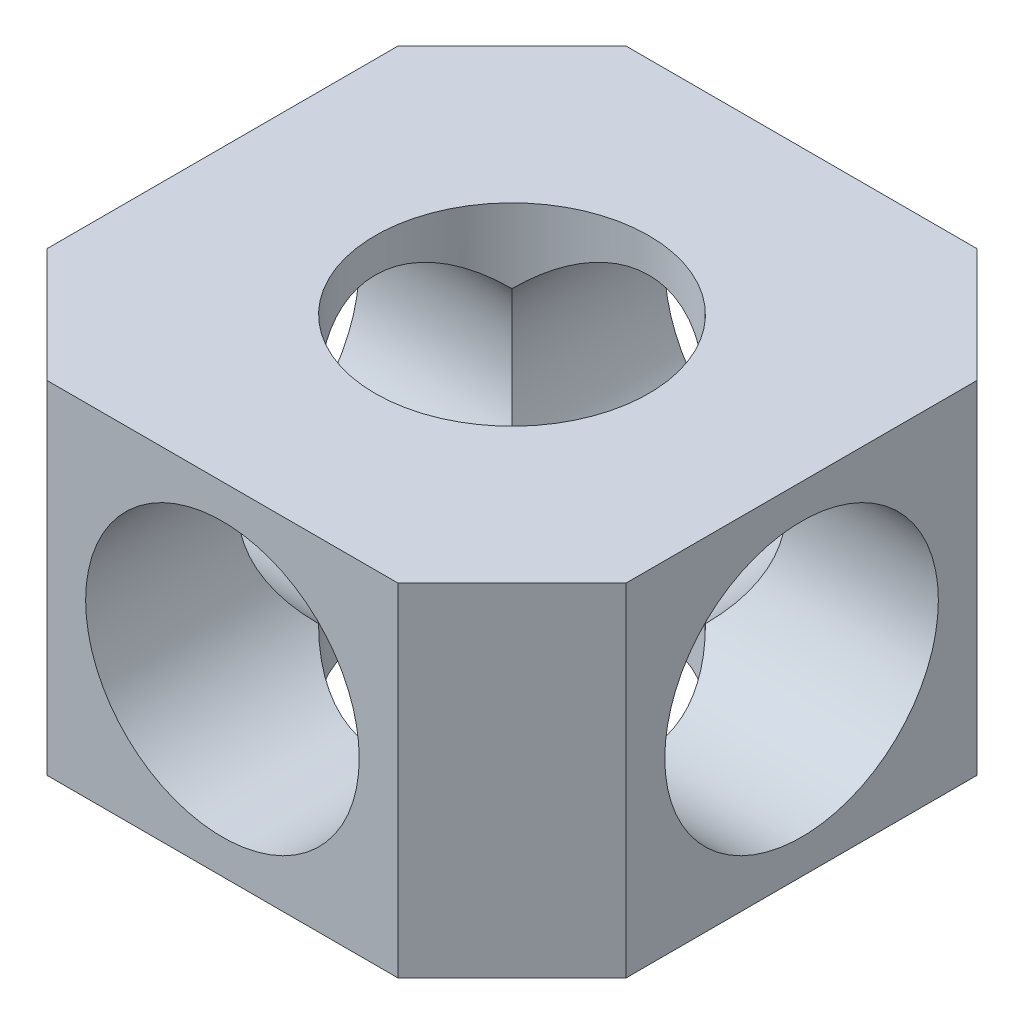
ISO-10303-21;
HEADER;
FILE_DESCRIPTION(('STEP AP214'),'2;1');
FILE_NAME('part.step','',(''),(''),'','','');
FILE_SCHEMA(('AUTOMOTIVE_DESIGN { 1 0 10303 214 1 1 1 1 }'));
ENDSEC;
DATA;
#1=APPLICATION_CONTEXT('core data for automotive mechanical design processes');
#2=APPLICATION_PROTOCOL_DEFINITION('international standard','automotive_design',2000,#1);
#3=PRODUCT_CONTEXT('',#1,'mechanical');
#4=PRODUCT('Part','Part','',(#3));
#5=PRODUCT_RELATED_PRODUCT_CATEGORY('part','',(#4));
#6=PRODUCT_DEFINITION_FORMATION('','',#4);
#7=PRODUCT_DEFINITION_CONTEXT('part definition',#1,'design');
#8=PRODUCT_DEFINITION('design','',#6,#7);
#9=PRODUCT_DEFINITION_SHAPE('','',#8);
#10=(LENGTH_UNIT() NAMED_UNIT(*) SI_UNIT(.MILLI.,.METRE.));
#11=(NAMED_UNIT(*) PLANE_ANGLE_UNIT() SI_UNIT($,.RADIAN.));
#12=(NAMED_UNIT(*) SI_UNIT($,.STERADIAN.) SOLID_ANGLE_UNIT());
#13=UNCERTAINTY_MEASURE_WITH_UNIT(LENGTH_MEASURE(1.E-05),#10,'distance_accuracy_value','');
#14=(GEOMETRIC_REPRESENTATION_CONTEXT(3) GLOBAL_UNCERTAINTY_ASSIGNED_CONTEXT((#13)) GLOBAL_UNIT_ASSIGNED_CONTEXT((#10,
#11,#12)) REPRESENTATION_CONTEXT('',''));
#15=CARTESIAN_POINT('',(0.,0.,0.));
#16=DIRECTION('',(0.,0.,1.));
#17=DIRECTION('',(1.,0.,0.));
#18=AXIS2_PLACEMENT_3D('',#15,#16,#17);
#19=CARTESIAN_POINT('',(0.,-190.5,0.));
#20=DIRECTION('',(0.,1.,0.));
#21=DIRECTION('',(0.,0.,1.));
#22=AXIS2_PLACEMENT_3D('',#19,#20,#21);
#23=CYLINDRICAL_SURFACE('',#22,152.4);
#24=CARTESIAN_POINT('',(0.,190.5,0.));
#25=DIRECTION('',(0.,1.,0.));
#26=DIRECTION('',(0.,0.,1.));
#27=AXIS2_PLACEMENT_3D('',#24,#25,#26);
#28=CIRCLE('',#27,152.4);
#29=CARTESIAN_POINT('',(0.,190.5,152.4));
#30=VERTEX_POINT('',#29);
#31=EDGE_CURVE('E183',#30,#30,#28,.T.);
#32=ORIENTED_EDGE('',*,*,#31,.T.);
#33=EDGE_LOOP('',(#32));
#34=FACE_BOUND('',#33,.T.);
#35=CARTESIAN_POINT('',(0.,0.,0.));
#36=DIRECTION('',(0.,0.707106781186547,0.707106781186547));
#37=DIRECTION('',(0.,0.707106781186547,-0.707106781186547));
#38=AXIS2_PLACEMENT_3D('',#35,#36,#37);
#39=ELLIPSE('',#38,215.52614690566,152.4);
#40=CARTESIAN_POINT('',(-107.763073452829,107.76307345283,-107.763073452831));
#41=VERTEX_POINT('',#40);
#42=CARTESIAN_POINT('',(107.76307345283,107.76307345283,-107.76307345283));
#43=VERTEX_POINT('',#42);
#44=EDGE_CURVE('E155',#41,#43,#39,.F.);
#45=ORIENTED_EDGE('',*,*,#44,.T.);
#46=CARTESIAN_POINT('',(0.,0.,0.));
#47=DIRECTION('',(-0.707106781186547,0.707106781186547,0.));
#48=DIRECTION('',(0.707106781186547,0.707106781186547,0.));
#49=AXIS2_PLACEMENT_3D('',#46,#47,#48);
#50=ELLIPSE('',#49,215.52614690566,152.4);
#51=CARTESIAN_POINT('',(107.763073452829,107.76307345283,107.763073452831));
#52=VERTEX_POINT('',#51);
#53=EDGE_CURVE('E58',#43,#52,#50,.F.);
#54=ORIENTED_EDGE('',*,*,#53,.T.);
#55=CARTESIAN_POINT('',(0.,0.,0.));
#56=DIRECTION('',(0.,0.707106781186547,-0.707106781186547));
#57=DIRECTION('',(0.,0.707106781186547,0.707106781186547));
#58=AXIS2_PLACEMENT_3D('',#55,#56,#57);
#59=ELLIPSE('',#58,215.52614690566,152.4);
#60=CARTESIAN_POINT('',(-107.76307345283,107.763073452829,107.763073452829));
#61=VERTEX_POINT('',#60);
#62=EDGE_CURVE('E161',#52,#61,#59,.F.);
#63=ORIENTED_EDGE('',*,*,#62,.T.);
#64=CARTESIAN_POINT('',(0.,0.,0.));
#65=DIRECTION('',(0.707106781186547,0.707106781186547,0.));
#66=DIRECTION('',(-0.707106781186547,0.707106781186547,0.));
#67=AXIS2_PLACEMENT_3D('',#64,#65,#66);
#68=ELLIPSE('',#67,215.52614690566,152.4);
#69=EDGE_CURVE('E132',#61,#41,#68,.F.);
#70=ORIENTED_EDGE('',*,*,#69,.T.);
#71=EDGE_LOOP('',(#45,#54,#63,#70));
#72=FACE_BOUND('',#71,.T.);
#73=ADVANCED_FACE('F41',(#34,#72),#23,.F.);
#74=CARTESIAN_POINT('',(322.58,190.5,-322.58));
#75=DIRECTION('',(-1.,0.,0.));
#76=DIRECTION('',(0.,0.,1.));
#77=AXIS2_PLACEMENT_3D('',#74,#75,#76);
#78=PLANE('',#77);
#79=CARTESIAN_POINT('',(322.580000000001,0.,1.12628205028402E-12));
#80=DIRECTION('',(-1.,0.,0.));
#81=DIRECTION('',(0.,0.,1.));
#82=AXIS2_PLACEMENT_3D('',#79,#80,#81);
#83=CIRCLE('',#82,152.4);
#84=CARTESIAN_POINT('',(322.58,0.,152.400000000001));
#85=VERTEX_POINT('',#84);
#86=EDGE_CURVE('E150',#85,#85,#83,.T.);
#87=ORIENTED_EDGE('',*,*,#86,.T.);
#88=EDGE_LOOP('',(#87));
#89=FACE_BOUND('',#88,.T.);
#90=DIRECTION('',(0.,0.,-1.));
#91=VECTOR('',#90,1.);
#92=CARTESIAN_POINT('',(322.58,-190.5,-322.58));
#93=LINE('',#92,#91);
#94=CARTESIAN_POINT('',(322.58,-190.5,195.58));
#95=VERTEX_POINT('',#94);
#96=CARTESIAN_POINT('',(322.58,-190.5,-195.58));
#97=VERTEX_POINT('',#96);
#98=EDGE_CURVE('E191',#95,#97,#93,.T.);
#99=ORIENTED_EDGE('',*,*,#98,.T.);
#100=DIRECTION('',(0.,1.,0.));
#101=VECTOR('',#100,1.);
#102=CARTESIAN_POINT('',(322.58,190.5,-195.58));
#103=LINE('',#102,#101);
#104=CARTESIAN_POINT('',(322.58,190.5,-195.58));
#105=VERTEX_POINT('',#104);
#106=EDGE_CURVE('E275',#97,#105,#103,.T.);
#107=ORIENTED_EDGE('',*,*,#106,.T.);
#108=DIRECTION('',(0.,0.,-1.));
#109=VECTOR('',#108,1.);
#110=CARTESIAN_POINT('',(322.58,190.5,-322.58));
#111=LINE('',#110,#109);
#112=CARTESIAN_POINT('',(322.58,190.5,195.58));
#113=VERTEX_POINT('',#112);
#114=EDGE_CURVE('E195',#113,#105,#111,.T.);
#115=ORIENTED_EDGE('',*,*,#114,.F.);
#116=DIRECTION('',(0.,-1.,0.));
#117=VECTOR('',#116,1.);
#118=CARTESIAN_POINT('',(322.58,190.5,195.58));
#119=LINE('',#118,#117);
#120=EDGE_CURVE('E271',#113,#95,#119,.T.);
#121=ORIENTED_EDGE('',*,*,#120,.T.);
#122=EDGE_LOOP('',(#99,#107,#115,#121));
#123=FACE_BOUND('',#122,.T.);
#124=ADVANCED_FACE('F281',(#89,#123),#78,.F.);
#125=CARTESIAN_POINT('',(-322.58,190.5,-322.58));
#126=DIRECTION('',(0.,0.,1.));
#127=DIRECTION('',(1.,0.,0.));
#128=AXIS2_PLACEMENT_3D('',#125,#126,#127);
#129=PLANE('',#128);
#130=CARTESIAN_POINT('',(0.,0.,-322.58));
#131=DIRECTION('',(0.,0.,1.));
#132=DIRECTION('',(1.,0.,0.));
#133=AXIS2_PLACEMENT_3D('',#130,#131,#132);
#134=CIRCLE('',#133,152.4);
#135=CARTESIAN_POINT('',(152.4,0.,-322.58));
#136=VERTEX_POINT('',#135);
#137=EDGE_CURVE('E179',#136,#136,#134,.T.);
#138=ORIENTED_EDGE('',*,*,#137,.T.);
#139=EDGE_LOOP('',(#138));
#140=FACE_BOUND('',#139,.T.);
#141=DIRECTION('',(-1.,0.,0.));
#142=VECTOR('',#141,1.);
#143=CARTESIAN_POINT('',(-322.58,-190.5,-322.58));
#144=LINE('',#143,#142);
#145=CARTESIAN_POINT('',(195.579999999999,-190.5,-322.58));
#146=VERTEX_POINT('',#145);
#147=CARTESIAN_POINT('',(-195.58,-190.5,-322.58));
#148=VERTEX_POINT('',#147);
#149=EDGE_CURVE('E216',#146,#148,#144,.T.);
#150=ORIENTED_EDGE('',*,*,#149,.T.);
#151=DIRECTION('',(0.,1.,0.));
#152=VECTOR('',#151,1.);
#153=CARTESIAN_POINT('',(-195.58,190.5,-322.58));
#154=LINE('',#153,#152);
#155=CARTESIAN_POINT('',(-195.58,190.5,-322.58));
#156=VERTEX_POINT('',#155);
#157=EDGE_CURVE('E249',#148,#156,#154,.T.);
#158=ORIENTED_EDGE('',*,*,#157,.T.);
#159=DIRECTION('',(-1.,0.,0.));
#160=VECTOR('',#159,1.);
#161=CARTESIAN_POINT('',(-322.58,190.5,-322.58));
#162=LINE('',#161,#160);
#163=CARTESIAN_POINT('',(195.579999999999,190.5,-322.58));
#164=VERTEX_POINT('',#163);
#165=EDGE_CURVE('E199',#164,#156,#162,.T.);
#166=ORIENTED_EDGE('',*,*,#165,.F.);
#167=DIRECTION('',(0.,-1.,0.));
#168=VECTOR('',#167,1.);
#169=CARTESIAN_POINT('',(195.579999999999,190.5,-322.58));
#170=LINE('',#169,#168);
#171=EDGE_CURVE('E245',#164,#146,#170,.T.);
#172=ORIENTED_EDGE('',*,*,#171,.T.);
#173=EDGE_LOOP('',(#150,#158,#166,#172));
#174=FACE_BOUND('',#173,.T.);
#175=ADVANCED_FACE('F294',(#140,#174),#129,.F.);
#176=CARTESIAN_POINT('',(-322.58,190.5,-322.58));
#177=DIRECTION('',(1.,0.,0.));
#178=DIRECTION('',(0.,0.,-1.));
#179=AXIS2_PLACEMENT_3D('',#176,#177,#178);
#180=PLANE('',#179);
#181=CARTESIAN_POINT('',(-322.58,0.,-1.12628205028402E-12));
#182=DIRECTION('',(-1.,0.,0.));
#183=DIRECTION('',(0.,0.,1.));
#184=AXIS2_PLACEMENT_3D('',#181,#182,#183);
#185=CIRCLE('',#184,152.4);
#186=CARTESIAN_POINT('',(-322.580000000001,0.,152.399999999999));
#187=VERTEX_POINT('',#186);
#188=EDGE_CURVE('E461',#187,#187,#185,.T.);
#189=ORIENTED_EDGE('',*,*,#188,.F.);
#190=EDGE_LOOP('',(#189));
#191=FACE_BOUND('',#190,.T.);
#192=DIRECTION('',(0.,0.,1.));
#193=VECTOR('',#192,1.);
#194=CARTESIAN_POINT('',(-322.58,190.5,-322.58));
#195=LINE('',#194,#193);
#196=CARTESIAN_POINT('',(-322.58,190.5,-195.58));
#197=VERTEX_POINT('',#196);
#198=CARTESIAN_POINT('',(-322.58,190.5,195.58));
#199=VERTEX_POINT('',#198);
#200=EDGE_CURVE('E204',#197,#199,#195,.T.);
#201=ORIENTED_EDGE('',*,*,#200,.F.);
#202=DIRECTION('',(0.,-1.,0.));
#203=VECTOR('',#202,1.);
#204=CARTESIAN_POINT('',(-322.58,190.5,-195.58));
#205=LINE('',#204,#203);
#206=CARTESIAN_POINT('',(-322.58,-190.5,-195.58));
#207=VERTEX_POINT('',#206);
#208=EDGE_CURVE('E229',#197,#207,#205,.T.);
#209=ORIENTED_EDGE('',*,*,#208,.T.);
#210=DIRECTION('',(0.,0.,1.));
#211=VECTOR('',#210,1.);
#212=CARTESIAN_POINT('',(-322.58,-190.5,-322.58));
#213=LINE('',#212,#211);
#214=CARTESIAN_POINT('',(-322.58,-190.5,195.58));
#215=VERTEX_POINT('',#214);
#216=EDGE_CURVE('E220',#207,#215,#213,.T.);
#217=ORIENTED_EDGE('',*,*,#216,.T.);
#218=DIRECTION('',(0.,1.,0.));
#219=VECTOR('',#218,1.);
#220=CARTESIAN_POINT('',(-322.58,190.5,195.58));
#221=LINE('',#220,#219);
#222=EDGE_CURVE('E212',#215,#199,#221,.T.);
#223=ORIENTED_EDGE('',*,*,#222,.T.);
#224=EDGE_LOOP('',(#201,#209,#217,#223));
#225=FACE_BOUND('',#224,.T.);
#226=ADVANCED_FACE('F305',(#191,#225),#180,.F.);
#227=CARTESIAN_POINT('',(-322.58,190.5,322.58));
#228=DIRECTION('',(0.,0.,-1.));
#229=DIRECTION('',(-1.,0.,0.));
#230=AXIS2_PLACEMENT_3D('',#227,#228,#229);
#231=PLANE('',#230);
#232=CARTESIAN_POINT('',(0.,0.,322.58));
#233=DIRECTION('',(0.,0.,1.));
#234=DIRECTION('',(1.,0.,0.));
#235=AXIS2_PLACEMENT_3D('',#232,#233,#234);
#236=CIRCLE('',#235,152.4);
#237=CARTESIAN_POINT('',(152.4,0.,322.58));
#238=VERTEX_POINT('',#237);
#239=EDGE_CURVE('E178',#238,#238,#236,.T.);
#240=ORIENTED_EDGE('',*,*,#239,.F.);
#241=EDGE_LOOP('',(#240));
#242=FACE_BOUND('',#241,.T.);
#243=DIRECTION('',(1.,0.,0.));
#244=VECTOR('',#243,1.);
#245=CARTESIAN_POINT('',(-322.58,190.5,322.58));
#246=LINE('',#245,#244);
#247=CARTESIAN_POINT('',(-195.58,190.5,322.58));
#248=VERTEX_POINT('',#247);
#249=CARTESIAN_POINT('',(195.579999999999,190.5,322.58));
#250=VERTEX_POINT('',#249);
#251=EDGE_CURVE('E208',#248,#250,#246,.T.);
#252=ORIENTED_EDGE('',*,*,#251,.F.);
#253=DIRECTION('',(0.,-1.,0.));
#254=VECTOR('',#253,1.);
#255=CARTESIAN_POINT('',(-195.58,190.5,322.58));
#256=LINE('',#255,#254);
#257=CARTESIAN_POINT('',(-195.58,-190.5,322.58));
#258=VERTEX_POINT('',#257);
#259=EDGE_CURVE('E267',#248,#258,#256,.T.);
#260=ORIENTED_EDGE('',*,*,#259,.T.);
#261=DIRECTION('',(1.,0.,0.));
#262=VECTOR('',#261,1.);
#263=CARTESIAN_POINT('',(-322.58,-190.5,322.58));
#264=LINE('',#263,#262);
#265=CARTESIAN_POINT('',(195.579999999999,-190.5,322.58));
#266=VERTEX_POINT('',#265);
#267=EDGE_CURVE('E200',#258,#266,#264,.T.);
#268=ORIENTED_EDGE('',*,*,#267,.T.);
#269=DIRECTION('',(0.,1.,0.));
#270=VECTOR('',#269,1.);
#271=CARTESIAN_POINT('',(195.579999999999,190.5,322.58));
#272=LINE('',#271,#270);
#273=EDGE_CURVE('E264',#266,#250,#272,.T.);
#274=ORIENTED_EDGE('',*,*,#273,.T.);
#275=EDGE_LOOP('',(#252,#260,#268,#274));
#276=FACE_BOUND('',#275,.T.);
#277=ADVANCED_FACE('F314',(#242,#276),#231,.F.);
#278=CARTESIAN_POINT('',(0.,190.5,0.));
#279=DIRECTION('',(0.,1.,0.));
#280=DIRECTION('',(0.,0.,1.));
#281=AXIS2_PLACEMENT_3D('',#278,#279,#280);
#282=PLANE('',#281);
#283=ORIENTED_EDGE('',*,*,#31,.F.);
#284=EDGE_LOOP('',(#283));
#285=FACE_BOUND('',#284,.T.);
#286=ORIENTED_EDGE('',*,*,#165,.T.);
#287=DIRECTION('',(0.707106781186548,0.,-0.707106781186548));
#288=VECTOR('',#287,1.);
#289=CARTESIAN_POINT('',(-259.08,190.5,-259.08));
#290=LINE('',#289,#288);
#291=EDGE_CURVE('E261',#156,#197,#290,.F.);
#292=ORIENTED_EDGE('',*,*,#291,.T.);
#293=ORIENTED_EDGE('',*,*,#200,.T.);
#294=DIRECTION('',(-0.707106781186548,0.,-0.707106781186548));
#295=VECTOR('',#294,1.);
#296=CARTESIAN_POINT('',(-259.08,190.5,259.08));
#297=LINE('',#296,#295);
#298=EDGE_CURVE('E258',#199,#248,#297,.F.);
#299=ORIENTED_EDGE('',*,*,#298,.T.);
#300=ORIENTED_EDGE('',*,*,#251,.T.);
#301=DIRECTION('',(-0.707106781186548,0.,0.707106781186547));
#302=VECTOR('',#301,1.);
#303=CARTESIAN_POINT('',(259.08,190.5,259.08));
#304=LINE('',#303,#302);
#305=EDGE_CURVE('E252',#250,#113,#304,.F.);
#306=ORIENTED_EDGE('',*,*,#305,.T.);
#307=ORIENTED_EDGE('',*,*,#114,.T.);
#308=DIRECTION('',(0.707106781186548,0.,0.707106781186548));
#309=VECTOR('',#308,1.);
#310=CARTESIAN_POINT('',(259.08,190.5,-259.08));
#311=LINE('',#310,#309);
#312=EDGE_CURVE('E255',#105,#164,#311,.F.);
#313=ORIENTED_EDGE('',*,*,#312,.T.);
#314=EDGE_LOOP('',(#286,#292,#293,#299,#300,#306,#307,#313));
#315=FACE_BOUND('',#314,.T.);
#316=ADVANCED_FACE('F287',(#285,#315),#282,.T.);
#317=CARTESIAN_POINT('',(0.,-190.5,0.));
#318=DIRECTION('',(0.,1.,0.));
#319=DIRECTION('',(0.,0.,1.));
#320=AXIS2_PLACEMENT_3D('',#317,#318,#319);
#321=PLANE('',#320);
#322=CARTESIAN_POINT('',(0.,-190.5,0.));
#323=DIRECTION('',(0.,1.,0.));
#324=DIRECTION('',(0.,0.,1.));
#325=AXIS2_PLACEMENT_3D('',#322,#323,#324);
#326=CIRCLE('',#325,152.4);
#327=CARTESIAN_POINT('',(0.,-190.5,152.4));
#328=VERTEX_POINT('',#327);
#329=EDGE_CURVE('E187',#328,#328,#326,.T.);
#330=ORIENTED_EDGE('',*,*,#329,.T.);
#331=EDGE_LOOP('',(#330));
#332=FACE_BOUND('',#331,.T.);
#333=ORIENTED_EDGE('',*,*,#216,.F.);
#334=DIRECTION('',(-0.707106781186548,0.,0.707106781186548));
#335=VECTOR('',#334,1.);
#336=CARTESIAN_POINT('',(-322.58,-190.5,-195.58));
#337=LINE('',#336,#335);
#338=EDGE_CURVE('E242',#207,#148,#337,.F.);
#339=ORIENTED_EDGE('',*,*,#338,.T.);
#340=ORIENTED_EDGE('',*,*,#149,.F.);
#341=DIRECTION('',(-0.707106781186548,0.,-0.707106781186548));
#342=VECTOR('',#341,1.);
#343=CARTESIAN_POINT('',(195.579999999999,-190.5,-322.58));
#344=LINE('',#343,#342);
#345=EDGE_CURVE('E236',#146,#97,#344,.F.);
#346=ORIENTED_EDGE('',*,*,#345,.T.);
#347=ORIENTED_EDGE('',*,*,#98,.F.);
#348=DIRECTION('',(0.707106781186548,0.,-0.707106781186547));
#349=VECTOR('',#348,1.);
#350=CARTESIAN_POINT('',(322.58,-190.5,195.58));
#351=LINE('',#350,#349);
#352=EDGE_CURVE('E233',#95,#266,#351,.F.);
#353=ORIENTED_EDGE('',*,*,#352,.T.);
#354=ORIENTED_EDGE('',*,*,#267,.F.);
#355=DIRECTION('',(0.707106781186548,0.,0.707106781186548));
#356=VECTOR('',#355,1.);
#357=CARTESIAN_POINT('',(-195.58,-190.5,322.58));
#358=LINE('',#357,#356);
#359=EDGE_CURVE('E239',#258,#215,#358,.F.);
#360=ORIENTED_EDGE('',*,*,#359,.T.);
#361=EDGE_LOOP('',(#333,#339,#340,#346,#347,#353,#354,#360));
#362=FACE_BOUND('',#361,.T.);
#363=ADVANCED_FACE('F298',(#332,#362),#321,.F.);
#364=CARTESIAN_POINT('',(-322.58,190.5,-195.58));
#365=DIRECTION('',(0.707106781186547,0.,0.707106781186547));
#366=DIRECTION('',(0.,-1.,0.));
#367=AXIS2_PLACEMENT_3D('',#364,#365,#366);
#368=PLANE('',#367);
#369=ORIENTED_EDGE('',*,*,#291,.F.);
#370=ORIENTED_EDGE('',*,*,#157,.F.);
#371=ORIENTED_EDGE('',*,*,#338,.F.);
#372=ORIENTED_EDGE('',*,*,#208,.F.);
#373=EDGE_LOOP('',(#369,#370,#371,#372));
#374=FACE_BOUND('',#373,.T.);
#375=ADVANCED_FACE('F302',(#374),#368,.F.);
#376=CARTESIAN_POINT('',(-195.58,190.5,322.58));
#377=DIRECTION('',(0.707106781186547,0.,-0.707106781186547));
#378=DIRECTION('',(0.,-1.,0.));
#379=AXIS2_PLACEMENT_3D('',#376,#377,#378);
#380=PLANE('',#379);
#381=ORIENTED_EDGE('',*,*,#298,.F.);
#382=ORIENTED_EDGE('',*,*,#222,.F.);
#383=ORIENTED_EDGE('',*,*,#359,.F.);
#384=ORIENTED_EDGE('',*,*,#259,.F.);
#385=EDGE_LOOP('',(#381,#382,#383,#384));
#386=FACE_BOUND('',#385,.T.);
#387=ADVANCED_FACE('F311',(#386),#380,.F.);
#388=CARTESIAN_POINT('',(195.579999999999,190.5,-322.58));
#389=DIRECTION('',(-0.707106781186548,0.,0.707106781186548));
#390=DIRECTION('',(0.,-1.,0.));
#391=AXIS2_PLACEMENT_3D('',#388,#389,#390);
#392=PLANE('',#391);
#393=ORIENTED_EDGE('',*,*,#312,.F.);
#394=ORIENTED_EDGE('',*,*,#106,.F.);
#395=ORIENTED_EDGE('',*,*,#345,.F.);
#396=ORIENTED_EDGE('',*,*,#171,.F.);
#397=EDGE_LOOP('',(#393,#394,#395,#396));
#398=FACE_BOUND('',#397,.T.);
#399=ADVANCED_FACE('F291',(#398),#392,.F.);
#400=CARTESIAN_POINT('',(322.58,190.5,195.58));
#401=DIRECTION('',(-0.707106781186547,0.,-0.707106781186548));
#402=DIRECTION('',(0.,-1.,0.));
#403=AXIS2_PLACEMENT_3D('',#400,#401,#402);
#404=PLANE('',#403);
#405=ORIENTED_EDGE('',*,*,#305,.F.);
#406=ORIENTED_EDGE('',*,*,#273,.F.);
#407=ORIENTED_EDGE('',*,*,#352,.F.);
#408=ORIENTED_EDGE('',*,*,#120,.F.);
#409=EDGE_LOOP('',(#405,#406,#407,#408));
#410=FACE_BOUND('',#409,.T.);
#411=ADVANCED_FACE('F44',(#410),#404,.F.);
#412=CARTESIAN_POINT('',(0.,0.,0.));
#413=DIRECTION('',(0.,0.707106781186547,0.707106781186547));
#414=DIRECTION('',(0.,0.707106781186547,-0.707106781186547));
#415=AXIS2_PLACEMENT_3D('',#412,#413,#414);
#416=ELLIPSE('',#415,215.52614690566,152.4);
#417=CARTESIAN_POINT('',(-107.76307345283,-107.763073452829,107.763073452829));
#418=VERTEX_POINT('',#417);
#419=CARTESIAN_POINT('',(107.763073452829,-107.76307345283,107.763073452831));
#420=VERTEX_POINT('',#419);
#421=EDGE_CURVE('E146',#418,#420,#416,.T.);
#422=ORIENTED_EDGE('',*,*,#421,.T.);
#423=CARTESIAN_POINT('',(0.,0.,0.));
#424=DIRECTION('',(0.707106781186547,0.707106781186547,0.));
#425=DIRECTION('',(-0.707106781186547,0.707106781186547,0.));
#426=AXIS2_PLACEMENT_3D('',#423,#424,#425);
#427=ELLIPSE('',#426,215.52614690566,152.4);
#428=CARTESIAN_POINT('',(107.76307345283,-107.763073452829,-107.763073452829));
#429=VERTEX_POINT('',#428);
#430=EDGE_CURVE('E170',#420,#429,#427,.T.);
#431=ORIENTED_EDGE('',*,*,#430,.T.);
#432=CARTESIAN_POINT('',(0.,0.,0.));
#433=DIRECTION('',(0.,0.707106781186547,-0.707106781186547));
#434=DIRECTION('',(0.,0.707106781186547,0.707106781186547));
#435=AXIS2_PLACEMENT_3D('',#432,#433,#434);
#436=ELLIPSE('',#435,215.52614690566,152.4);
#437=CARTESIAN_POINT('',(-107.76307345283,-107.76307345283,-107.76307345283));
#438=VERTEX_POINT('',#437);
#439=EDGE_CURVE('E148',#429,#438,#436,.T.);
#440=ORIENTED_EDGE('',*,*,#439,.T.);
#441=CARTESIAN_POINT('',(0.,0.,0.));
#442=DIRECTION('',(-0.707106781186547,0.707106781186547,0.));
#443=DIRECTION('',(0.707106781186547,0.707106781186547,0.));
#444=AXIS2_PLACEMENT_3D('',#441,#442,#443);
#445=ELLIPSE('',#444,215.52614690566,152.4);
#446=EDGE_CURVE('E65',#438,#418,#445,.T.);
#447=ORIENTED_EDGE('',*,*,#446,.T.);
#448=EDGE_LOOP('',(#422,#431,#440,#447));
#449=FACE_BOUND('',#448,.T.);
#450=ORIENTED_EDGE('',*,*,#329,.F.);
#451=EDGE_LOOP('',(#450));
#452=FACE_BOUND('',#451,.T.);
#453=ADVANCED_FACE('F143',(#449,#452),#23,.F.);
#454=CARTESIAN_POINT('',(0.,0.,-322.58));
#455=DIRECTION('',(0.,0.,1.));
#456=DIRECTION('',(1.,0.,0.));
#457=AXIS2_PLACEMENT_3D('',#454,#455,#456);
#458=CYLINDRICAL_SURFACE('',#457,152.4);
#459=ORIENTED_EDGE('',*,*,#239,.T.);
#460=EDGE_LOOP('',(#459));
#461=FACE_BOUND('',#460,.T.);
#462=ORIENTED_EDGE('',*,*,#62,.F.);
#463=CARTESIAN_POINT('',(0.,0.,0.));
#464=DIRECTION('',(0.707106781186551,0.,-0.707106781186544));
#465=DIRECTION('',(-0.707106781186544,0.,-0.707106781186551));
#466=AXIS2_PLACEMENT_3D('',#463,#464,#465);
#467=ELLIPSE('',#466,215.526146905661,152.4);
#468=EDGE_CURVE('E138',#52,#420,#467,.T.);
#469=ORIENTED_EDGE('',*,*,#468,.T.);
#470=ORIENTED_EDGE('',*,*,#421,.F.);
#471=CARTESIAN_POINT('',(0.,0.,0.));
#472=DIRECTION('',(-0.707106781186544,0.,-0.707106781186551));
#473=DIRECTION('',(0.707106781186551,0.,-0.707106781186544));
#474=AXIS2_PLACEMENT_3D('',#471,#472,#473);
#475=ELLIPSE('',#474,215.526146905659,152.4);
#476=EDGE_CURVE('E129',#418,#61,#475,.T.);
#477=ORIENTED_EDGE('',*,*,#476,.T.);
#478=EDGE_LOOP('',(#462,#469,#470,#477));
#479=FACE_BOUND('',#478,.T.);
#480=ADVANCED_FACE('F153',(#461,#479),#458,.F.);
#481=ORIENTED_EDGE('',*,*,#137,.F.);
#482=EDGE_LOOP('',(#481));
#483=FACE_BOUND('',#482,.T.);
#484=ORIENTED_EDGE('',*,*,#439,.F.);
#485=CARTESIAN_POINT('',(0.,0.,0.));
#486=DIRECTION('',(0.707106781186546,0.,0.707106781186549));
#487=DIRECTION('',(-0.707106781186549,0.,0.707106781186546));
#488=AXIS2_PLACEMENT_3D('',#485,#486,#487);
#489=ELLIPSE('',#488,215.526146905659,152.4);
#490=EDGE_CURVE('E11',#429,#43,#489,.T.);
#491=ORIENTED_EDGE('',*,*,#490,.T.);
#492=ORIENTED_EDGE('',*,*,#44,.F.);
#493=CARTESIAN_POINT('',(0.,0.,0.));
#494=DIRECTION('',(-0.707106781186549,0.,0.707106781186546));
#495=DIRECTION('',(0.707106781186546,0.,0.707106781186549));
#496=AXIS2_PLACEMENT_3D('',#493,#494,#495);
#497=ELLIPSE('',#496,215.52614690566,152.4);
#498=EDGE_CURVE('E51',#41,#438,#497,.T.);
#499=ORIENTED_EDGE('',*,*,#498,.T.);
#500=EDGE_LOOP('',(#484,#491,#492,#499));
#501=FACE_BOUND('',#500,.T.);
#502=ADVANCED_FACE('F167',(#483,#501),#458,.F.);
#503=CARTESIAN_POINT('',(322.580000000001,0.,1.12628205028402E-12));
#504=DIRECTION('',(-1.,0.,0.));
#505=DIRECTION('',(0.,0.,1.));
#506=AXIS2_PLACEMENT_3D('',#503,#504,#505);
#507=CYLINDRICAL_SURFACE('',#506,152.4);
#508=ORIENTED_EDGE('',*,*,#188,.T.);
#509=EDGE_LOOP('',(#508));
#510=FACE_BOUND('',#509,.T.);
#511=ORIENTED_EDGE('',*,*,#476,.F.);
#512=ORIENTED_EDGE('',*,*,#446,.F.);
#513=ORIENTED_EDGE('',*,*,#498,.F.);
#514=ORIENTED_EDGE('',*,*,#69,.F.);
#515=EDGE_LOOP('',(#511,#512,#513,#514));
#516=FACE_BOUND('',#515,.T.);
#517=ADVANCED_FACE('F130',(#510,#516),#507,.F.);
#518=ORIENTED_EDGE('',*,*,#86,.F.);
#519=EDGE_LOOP('',(#518));
#520=FACE_BOUND('',#519,.T.);
#521=ORIENTED_EDGE('',*,*,#490,.F.);
#522=ORIENTED_EDGE('',*,*,#430,.F.);
#523=ORIENTED_EDGE('',*,*,#468,.F.);
#524=ORIENTED_EDGE('',*,*,#53,.F.);
#525=EDGE_LOOP('',(#521,#522,#523,#524));
#526=FACE_BOUND('',#525,.T.);
#527=ADVANCED_FACE('F446',(#520,#526),#507,.F.);
#528=CLOSED_SHELL('',(#73,#124,#175,#226,#277,#316,#363,#375,#387,#399,#411,#453,#480,#502,#517,#527));
#529=MANIFOLD_SOLID_BREP('B2',#528);
#530=ADVANCED_BREP_SHAPE_REPRESENTATION('',(#18,#529),#14);
#531=SHAPE_DEFINITION_REPRESENTATION(#9,#530);
ENDSEC;
END-ISO-10303-21;
